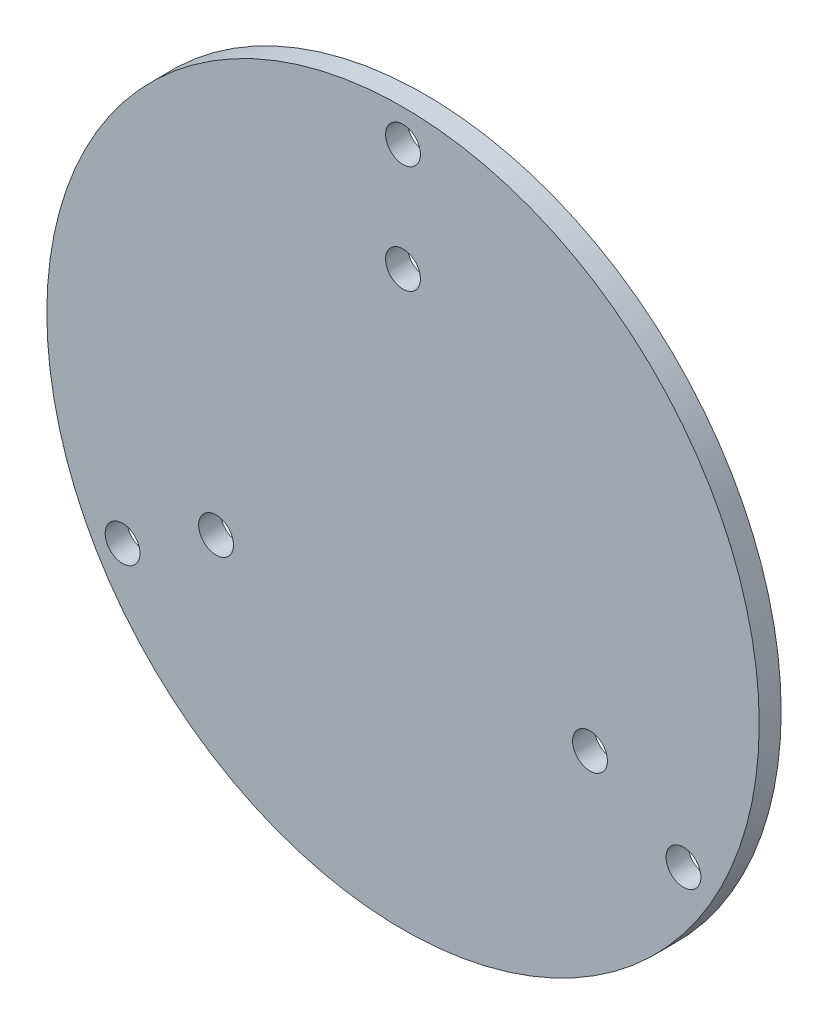
ISO-10303-21;
HEADER;
FILE_DESCRIPTION(('STEP AP214'),'2;1');
FILE_NAME('part.step','',(''),(''),'','','');
FILE_SCHEMA(('AUTOMOTIVE_DESIGN { 1 0 10303 214 1 1 1 1 }'));
ENDSEC;
DATA;
#1=APPLICATION_CONTEXT('core data for automotive mechanical design processes');
#2=APPLICATION_PROTOCOL_DEFINITION('international standard','automotive_design',2000,#1);
#3=PRODUCT_CONTEXT('',#1,'mechanical');
#4=PRODUCT('Part','Part','',(#3));
#5=PRODUCT_RELATED_PRODUCT_CATEGORY('part','',(#4));
#6=PRODUCT_DEFINITION_FORMATION('','',#4);
#7=PRODUCT_DEFINITION_CONTEXT('part definition',#1,'design');
#8=PRODUCT_DEFINITION('design','',#6,#7);
#9=PRODUCT_DEFINITION_SHAPE('','',#8);
#10=(LENGTH_UNIT() NAMED_UNIT(*) SI_UNIT(.MILLI.,.METRE.));
#11=(NAMED_UNIT(*) PLANE_ANGLE_UNIT() SI_UNIT($,.RADIAN.));
#12=(NAMED_UNIT(*) SI_UNIT($,.STERADIAN.) SOLID_ANGLE_UNIT());
#13=UNCERTAINTY_MEASURE_WITH_UNIT(LENGTH_MEASURE(1.E-05),#10,'distance_accuracy_value','');
#14=(GEOMETRIC_REPRESENTATION_CONTEXT(3) GLOBAL_UNCERTAINTY_ASSIGNED_CONTEXT((#13)) GLOBAL_UNIT_ASSIGNED_CONTEXT((#10,
#11,#12)) REPRESENTATION_CONTEXT('',''));
#15=CARTESIAN_POINT('',(0.,0.,0.));
#16=DIRECTION('',(0.,0.,1.));
#17=DIRECTION('',(1.,0.,0.));
#18=AXIS2_PLACEMENT_3D('',#15,#16,#17);
#19=CARTESIAN_POINT('',(0.,0.,1.016));
#20=DIRECTION('',(0.,0.,-1.));
#21=DIRECTION('',(-1.,0.,0.));
#22=AXIS2_PLACEMENT_3D('',#19,#20,#21);
#23=CYLINDRICAL_SURFACE('',#22,16.5);
#24=CARTESIAN_POINT('',(0.,0.,1.016));
#25=DIRECTION('',(0.,0.,1.));
#26=DIRECTION('',(1.,0.,0.));
#27=AXIS2_PLACEMENT_3D('',#24,#25,#26);
#28=CIRCLE('',#27,16.5);
#29=CARTESIAN_POINT('',(16.5,0.,1.016));
#30=VERTEX_POINT('',#29);
#31=EDGE_CURVE('E10',#30,#30,#28,.T.);
#32=ORIENTED_EDGE('',*,*,#31,.F.);
#33=EDGE_LOOP('',(#32));
#34=FACE_BOUND('',#33,.T.);
#35=CARTESIAN_POINT('',(0.,0.,0.));
#36=DIRECTION('',(0.,0.,1.));
#37=DIRECTION('',(1.,0.,0.));
#38=AXIS2_PLACEMENT_3D('',#35,#36,#37);
#39=CIRCLE('',#38,16.5);
#40=CARTESIAN_POINT('',(16.5,0.,0.));
#41=VERTEX_POINT('',#40);
#42=EDGE_CURVE('E40',#41,#41,#39,.T.);
#43=ORIENTED_EDGE('',*,*,#42,.T.);
#44=EDGE_LOOP('',(#43));
#45=FACE_BOUND('',#44,.T.);
#46=ADVANCED_FACE('F33',(#34,#45),#23,.T.);
#47=CARTESIAN_POINT('',(0.,0.,1.016));
#48=DIRECTION('',(0.,0.,1.));
#49=DIRECTION('',(1.,0.,0.));
#50=AXIS2_PLACEMENT_3D('',#47,#48,#49);
#51=PLANE('',#50);
#52=CARTESIAN_POINT('',(0.,15.,1.016));
#53=DIRECTION('',(0.,0.,1.));
#54=DIRECTION('',(1.,0.,0.));
#55=AXIS2_PLACEMENT_3D('',#52,#53,#54);
#56=CIRCLE('',#55,0.806450000000001);
#57=CARTESIAN_POINT('',(0.806450000000101,15.,1.016));
#58=VERTEX_POINT('',#57);
#59=EDGE_CURVE('E66',#58,#58,#56,.T.);
#60=ORIENTED_EDGE('',*,*,#59,.F.);
#61=EDGE_LOOP('',(#60));
#62=FACE_BOUND('',#61,.T.);
#63=CARTESIAN_POINT('',(12.9903810567665,-7.50000000000015,1.016));
#64=DIRECTION('',(0.,0.,1.));
#65=DIRECTION('',(1.,0.,0.));
#66=AXIS2_PLACEMENT_3D('',#63,#64,#65);
#67=CIRCLE('',#66,0.80645);
#68=CARTESIAN_POINT('',(13.7968310567665,-7.50000000000015,1.016));
#69=VERTEX_POINT('',#68);
#70=EDGE_CURVE('E56',#69,#69,#67,.T.);
#71=ORIENTED_EDGE('',*,*,#70,.F.);
#72=EDGE_LOOP('',(#71));
#73=FACE_BOUND('',#72,.T.);
#74=CARTESIAN_POINT('',(-12.9903810567667,-7.49999999999979,1.016));
#75=DIRECTION('',(0.,0.,1.));
#76=DIRECTION('',(1.,0.,0.));
#77=AXIS2_PLACEMENT_3D('',#74,#75,#76);
#78=CIRCLE('',#77,0.806450000000001);
#79=CARTESIAN_POINT('',(-12.1839310567667,-7.49999999999979,1.016));
#80=VERTEX_POINT('',#79);
#81=EDGE_CURVE('E53',#80,#80,#78,.T.);
#82=ORIENTED_EDGE('',*,*,#81,.F.);
#83=EDGE_LOOP('',(#82));
#84=FACE_BOUND('',#83,.T.);
#85=CARTESIAN_POINT('',(0.,10.,1.016));
#86=DIRECTION('',(0.,0.,-1.));
#87=DIRECTION('',(-1.,0.,0.));
#88=AXIS2_PLACEMENT_3D('',#85,#86,#87);
#89=CIRCLE('',#88,0.80645);
#90=CARTESIAN_POINT('',(-0.80645,10.,1.016));
#91=VERTEX_POINT('',#90);
#92=EDGE_CURVE('E71',#91,#91,#89,.T.);
#93=ORIENTED_EDGE('',*,*,#92,.T.);
#94=EDGE_LOOP('',(#93));
#95=FACE_BOUND('',#94,.T.);
#96=CARTESIAN_POINT('',(-8.66025403784437,-5.00000000000004,1.016));
#97=DIRECTION('',(0.,0.,-1.));
#98=DIRECTION('',(-1.,0.,0.));
#99=AXIS2_PLACEMENT_3D('',#96,#97,#98);
#100=CIRCLE('',#99,0.80645);
#101=CARTESIAN_POINT('',(-9.46670403784437,-5.00000000000004,1.016));
#102=VERTEX_POINT('',#101);
#103=EDGE_CURVE('E77',#102,#102,#100,.T.);
#104=ORIENTED_EDGE('',*,*,#103,.T.);
#105=EDGE_LOOP('',(#104));
#106=FACE_BOUND('',#105,.T.);
#107=CARTESIAN_POINT('',(8.66025403784443,-4.99999999999992,1.016));
#108=DIRECTION('',(0.,0.,-1.));
#109=DIRECTION('',(-1.,0.,0.));
#110=AXIS2_PLACEMENT_3D('',#107,#108,#109);
#111=CIRCLE('',#110,0.80645);
#112=CARTESIAN_POINT('',(7.85380403784443,-4.99999999999992,1.016));
#113=VERTEX_POINT('',#112);
#114=EDGE_CURVE('E45',#113,#113,#111,.T.);
#115=ORIENTED_EDGE('',*,*,#114,.T.);
#116=EDGE_LOOP('',(#115));
#117=FACE_BOUND('',#116,.T.);
#118=ORIENTED_EDGE('',*,*,#31,.T.);
#119=EDGE_LOOP('',(#118));
#120=FACE_BOUND('',#119,.T.);
#121=ADVANCED_FACE('F86',(#62,#73,#84,#95,#106,#117,#120),#51,.T.);
#122=CARTESIAN_POINT('',(0.,0.,0.));
#123=DIRECTION('',(0.,0.,1.));
#124=DIRECTION('',(1.,0.,0.));
#125=AXIS2_PLACEMENT_3D('',#122,#123,#124);
#126=PLANE('',#125);
#127=CARTESIAN_POINT('',(0.,15.,0.));
#128=DIRECTION('',(0.,0.,1.));
#129=DIRECTION('',(1.,0.,0.));
#130=AXIS2_PLACEMENT_3D('',#127,#128,#129);
#131=CIRCLE('',#130,0.806450000000001);
#132=CARTESIAN_POINT('',(0.806450000000101,15.,0.));
#133=VERTEX_POINT('',#132);
#134=EDGE_CURVE('E36',#133,#133,#131,.T.);
#135=ORIENTED_EDGE('',*,*,#134,.T.);
#136=EDGE_LOOP('',(#135));
#137=FACE_BOUND('',#136,.T.);
#138=CARTESIAN_POINT('',(12.9903810567665,-7.50000000000015,0.));
#139=DIRECTION('',(0.,0.,1.));
#140=DIRECTION('',(1.,0.,0.));
#141=AXIS2_PLACEMENT_3D('',#138,#139,#140);
#142=CIRCLE('',#141,0.80645);
#143=CARTESIAN_POINT('',(13.7968310567665,-7.50000000000015,0.));
#144=VERTEX_POINT('',#143);
#145=EDGE_CURVE('E54',#144,#144,#142,.T.);
#146=ORIENTED_EDGE('',*,*,#145,.T.);
#147=EDGE_LOOP('',(#146));
#148=FACE_BOUND('',#147,.T.);
#149=CARTESIAN_POINT('',(-12.9903810567667,-7.49999999999979,0.));
#150=DIRECTION('',(0.,0.,1.));
#151=DIRECTION('',(1.,0.,0.));
#152=AXIS2_PLACEMENT_3D('',#149,#150,#151);
#153=CIRCLE('',#152,0.806450000000001);
#154=CARTESIAN_POINT('',(-12.1839310567667,-7.49999999999979,0.));
#155=VERTEX_POINT('',#154);
#156=EDGE_CURVE('E50',#155,#155,#153,.T.);
#157=ORIENTED_EDGE('',*,*,#156,.T.);
#158=EDGE_LOOP('',(#157));
#159=FACE_BOUND('',#158,.T.);
#160=CARTESIAN_POINT('',(0.,10.,0.));
#161=DIRECTION('',(0.,0.,-1.));
#162=DIRECTION('',(-1.,0.,0.));
#163=AXIS2_PLACEMENT_3D('',#160,#161,#162);
#164=CIRCLE('',#163,0.80645);
#165=CARTESIAN_POINT('',(-0.80645,10.,0.));
#166=VERTEX_POINT('',#165);
#167=EDGE_CURVE('E52',#166,#166,#164,.T.);
#168=ORIENTED_EDGE('',*,*,#167,.F.);
#169=EDGE_LOOP('',(#168));
#170=FACE_BOUND('',#169,.T.);
#171=CARTESIAN_POINT('',(-8.66025403784437,-5.00000000000004,0.));
#172=DIRECTION('',(0.,0.,-1.));
#173=DIRECTION('',(-1.,0.,0.));
#174=AXIS2_PLACEMENT_3D('',#171,#172,#173);
#175=CIRCLE('',#174,0.80645);
#176=CARTESIAN_POINT('',(-9.46670403784437,-5.00000000000004,0.));
#177=VERTEX_POINT('',#176);
#178=EDGE_CURVE('E74',#177,#177,#175,.T.);
#179=ORIENTED_EDGE('',*,*,#178,.F.);
#180=EDGE_LOOP('',(#179));
#181=FACE_BOUND('',#180,.T.);
#182=CARTESIAN_POINT('',(8.66025403784443,-4.99999999999992,0.));
#183=DIRECTION('',(0.,0.,-1.));
#184=DIRECTION('',(-1.,0.,0.));
#185=AXIS2_PLACEMENT_3D('',#182,#183,#184);
#186=CIRCLE('',#185,0.80645);
#187=CARTESIAN_POINT('',(7.85380403784443,-4.99999999999992,0.));
#188=VERTEX_POINT('',#187);
#189=EDGE_CURVE('E79',#188,#188,#186,.T.);
#190=ORIENTED_EDGE('',*,*,#189,.F.);
#191=EDGE_LOOP('',(#190));
#192=FACE_BOUND('',#191,.T.);
#193=ORIENTED_EDGE('',*,*,#42,.F.);
#194=EDGE_LOOP('',(#193));
#195=FACE_BOUND('',#194,.T.);
#196=ADVANCED_FACE('F91',(#137,#148,#159,#170,#181,#192,#195),#126,.F.);
#197=CARTESIAN_POINT('',(8.66025403784443,-4.99999999999992,0.));
#198=DIRECTION('',(0.,0.,-1.));
#199=DIRECTION('',(-1.,0.,0.));
#200=AXIS2_PLACEMENT_3D('',#197,#198,#199);
#201=CYLINDRICAL_SURFACE('',#200,0.80645);
#202=ORIENTED_EDGE('',*,*,#114,.F.);
#203=EDGE_LOOP('',(#202));
#204=FACE_BOUND('',#203,.T.);
#205=ORIENTED_EDGE('',*,*,#189,.T.);
#206=EDGE_LOOP('',(#205));
#207=FACE_BOUND('',#206,.T.);
#208=ADVANCED_FACE('F88',(#204,#207),#201,.F.);
#209=CARTESIAN_POINT('',(-8.66025403784437,-5.00000000000004,0.));
#210=DIRECTION('',(0.,0.,-1.));
#211=DIRECTION('',(-1.,0.,0.));
#212=AXIS2_PLACEMENT_3D('',#209,#210,#211);
#213=CYLINDRICAL_SURFACE('',#212,0.80645);
#214=ORIENTED_EDGE('',*,*,#103,.F.);
#215=EDGE_LOOP('',(#214));
#216=FACE_BOUND('',#215,.T.);
#217=ORIENTED_EDGE('',*,*,#178,.T.);
#218=EDGE_LOOP('',(#217));
#219=FACE_BOUND('',#218,.T.);
#220=ADVANCED_FACE('F90',(#216,#219),#213,.F.);
#221=CARTESIAN_POINT('',(0.,10.,0.));
#222=DIRECTION('',(0.,0.,-1.));
#223=DIRECTION('',(-1.,0.,0.));
#224=AXIS2_PLACEMENT_3D('',#221,#222,#223);
#225=CYLINDRICAL_SURFACE('',#224,0.80645);
#226=ORIENTED_EDGE('',*,*,#92,.F.);
#227=EDGE_LOOP('',(#226));
#228=FACE_BOUND('',#227,.T.);
#229=ORIENTED_EDGE('',*,*,#167,.T.);
#230=EDGE_LOOP('',(#229));
#231=FACE_BOUND('',#230,.T.);
#232=ADVANCED_FACE('F97',(#228,#231),#225,.F.);
#233=CARTESIAN_POINT('',(-12.9903810567667,-7.49999999999979,-3.984));
#234=DIRECTION('',(0.,0.,1.));
#235=DIRECTION('',(1.,0.,0.));
#236=AXIS2_PLACEMENT_3D('',#233,#234,#235);
#237=CYLINDRICAL_SURFACE('',#236,0.806450000000001);
#238=ORIENTED_EDGE('',*,*,#81,.T.);
#239=EDGE_LOOP('',(#238));
#240=FACE_BOUND('',#239,.T.);
#241=ORIENTED_EDGE('',*,*,#156,.F.);
#242=EDGE_LOOP('',(#241));
#243=FACE_BOUND('',#242,.T.);
#244=ADVANCED_FACE('F129',(#240,#243),#237,.F.);
#245=CARTESIAN_POINT('',(12.9903810567665,-7.50000000000015,-3.984));
#246=DIRECTION('',(0.,0.,1.));
#247=DIRECTION('',(1.,0.,0.));
#248=AXIS2_PLACEMENT_3D('',#245,#246,#247);
#249=CYLINDRICAL_SURFACE('',#248,0.80645);
#250=ORIENTED_EDGE('',*,*,#70,.T.);
#251=EDGE_LOOP('',(#250));
#252=FACE_BOUND('',#251,.T.);
#253=ORIENTED_EDGE('',*,*,#145,.F.);
#254=EDGE_LOOP('',(#253));
#255=FACE_BOUND('',#254,.T.);
#256=ADVANCED_FACE('F136',(#252,#255),#249,.F.);
#257=CARTESIAN_POINT('',(0.,15.,-3.984));
#258=DIRECTION('',(0.,0.,1.));
#259=DIRECTION('',(1.,0.,0.));
#260=AXIS2_PLACEMENT_3D('',#257,#258,#259);
#261=CYLINDRICAL_SURFACE('',#260,0.806450000000001);
#262=ORIENTED_EDGE('',*,*,#59,.T.);
#263=EDGE_LOOP('',(#262));
#264=FACE_BOUND('',#263,.T.);
#265=ORIENTED_EDGE('',*,*,#134,.F.);
#266=EDGE_LOOP('',(#265));
#267=FACE_BOUND('',#266,.T.);
#268=ADVANCED_FACE('F142',(#264,#267),#261,.F.);
#269=CLOSED_SHELL('',(#46,#121,#196,#208,#220,#232,#244,#256,#268));
#270=MANIFOLD_SOLID_BREP('B2',#269);
#271=ADVANCED_BREP_SHAPE_REPRESENTATION('',(#18,#270),#14);
#272=SHAPE_DEFINITION_REPRESENTATION(#9,#271);
ENDSEC;
END-ISO-10303-21;
